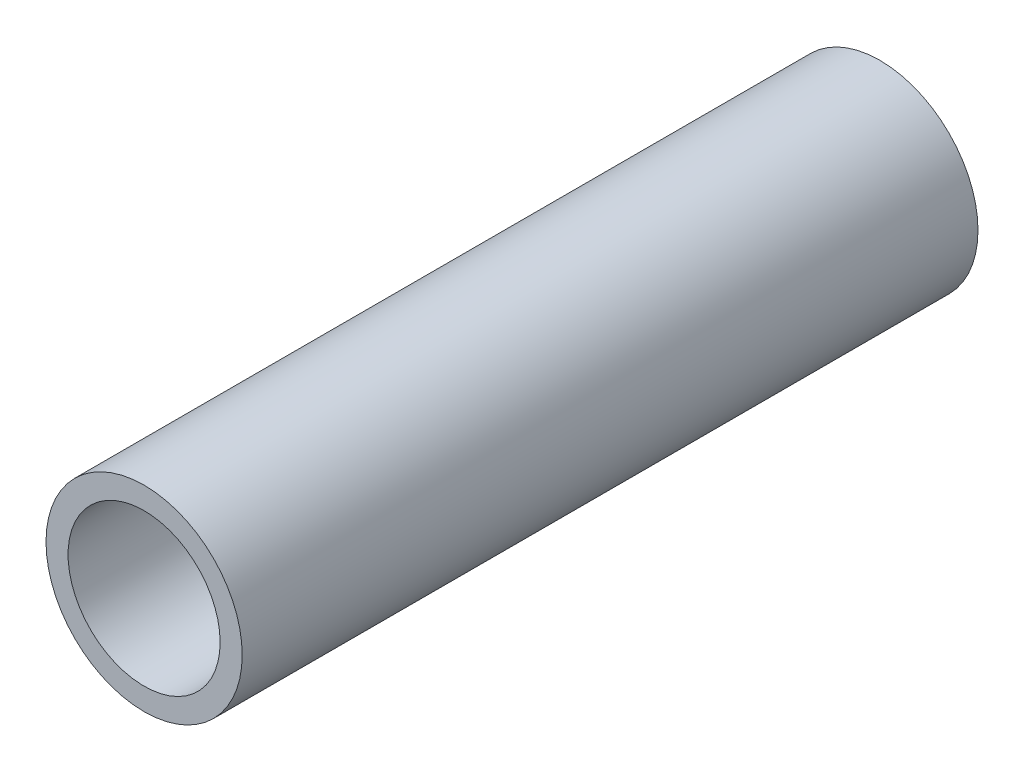
ISO-10303-21;
HEADER;
FILE_DESCRIPTION(('STEP AP214'),'2;1');
FILE_NAME('part.step','',(''),(''),'','','');
FILE_SCHEMA(('AUTOMOTIVE_DESIGN { 1 0 10303 214 1 1 1 1 }'));
ENDSEC;
DATA;
#1=APPLICATION_CONTEXT('core data for automotive mechanical design processes');
#2=APPLICATION_PROTOCOL_DEFINITION('international standard','automotive_design',2000,#1);
#3=PRODUCT_CONTEXT('',#1,'mechanical');
#4=PRODUCT('Part','Part','',(#3));
#5=PRODUCT_RELATED_PRODUCT_CATEGORY('part','',(#4));
#6=PRODUCT_DEFINITION_FORMATION('','',#4);
#7=PRODUCT_DEFINITION_CONTEXT('part definition',#1,'design');
#8=PRODUCT_DEFINITION('design','',#6,#7);
#9=PRODUCT_DEFINITION_SHAPE('','',#8);
#10=(LENGTH_UNIT() NAMED_UNIT(*) SI_UNIT(.MILLI.,.METRE.));
#11=(NAMED_UNIT(*) PLANE_ANGLE_UNIT() SI_UNIT($,.RADIAN.));
#12=(NAMED_UNIT(*) SI_UNIT($,.STERADIAN.) SOLID_ANGLE_UNIT());
#13=UNCERTAINTY_MEASURE_WITH_UNIT(LENGTH_MEASURE(1.E-05),#10,'distance_accuracy_value','');
#14=(GEOMETRIC_REPRESENTATION_CONTEXT(3) GLOBAL_UNCERTAINTY_ASSIGNED_CONTEXT((#13)) GLOBAL_UNIT_ASSIGNED_CONTEXT((#10,
#11,#12)) REPRESENTATION_CONTEXT('',''));
#15=CARTESIAN_POINT('',(0.,0.,0.));
#16=DIRECTION('',(0.,0.,1.));
#17=DIRECTION('',(1.,0.,0.));
#18=AXIS2_PLACEMENT_3D('',#15,#16,#17);
#19=CARTESIAN_POINT('',(0.,0.,7.5));
#20=DIRECTION('',(0.,0.,1.));
#21=DIRECTION('',(1.,0.,0.));
#22=AXIS2_PLACEMENT_3D('',#19,#20,#21);
#23=PLANE('',#22);
#24=CARTESIAN_POINT('',(0.,0.,7.5));
#25=DIRECTION('',(0.,0.,1.));
#26=DIRECTION('',(1.,0.,0.));
#27=AXIS2_PLACEMENT_3D('',#24,#25,#26);
#28=CIRCLE('',#27,1.);
#29=CARTESIAN_POINT('',(1.,0.,7.5));
#30=VERTEX_POINT('',#29);
#31=EDGE_CURVE('E10',#30,#30,#28,.T.);
#32=ORIENTED_EDGE('',*,*,#31,.T.);
#33=EDGE_LOOP('',(#32));
#34=FACE_BOUND('',#33,.T.);
#35=CARTESIAN_POINT('',(0.,0.,7.5));
#36=DIRECTION('',(0.,0.,1.));
#37=DIRECTION('',(1.,0.,0.));
#38=AXIS2_PLACEMENT_3D('',#35,#36,#37);
#39=CIRCLE('',#38,0.775);
#40=CARTESIAN_POINT('',(0.775,0.,7.5));
#41=VERTEX_POINT('',#40);
#42=EDGE_CURVE('E46',#41,#41,#39,.T.);
#43=ORIENTED_EDGE('',*,*,#42,.F.);
#44=EDGE_LOOP('',(#43));
#45=FACE_BOUND('',#44,.T.);
#46=ADVANCED_FACE('F35',(#34,#45),#23,.T.);
#47=CARTESIAN_POINT('',(0.,0.,0.));
#48=DIRECTION('',(0.,0.,1.));
#49=DIRECTION('',(1.,0.,0.));
#50=AXIS2_PLACEMENT_3D('',#47,#48,#49);
#51=PLANE('',#50);
#52=CARTESIAN_POINT('',(0.,0.,0.));
#53=DIRECTION('',(0.,0.,1.));
#54=DIRECTION('',(1.,0.,0.));
#55=AXIS2_PLACEMENT_3D('',#52,#53,#54);
#56=CIRCLE('',#55,1.);
#57=CARTESIAN_POINT('',(1.,0.,0.));
#58=VERTEX_POINT('',#57);
#59=EDGE_CURVE('E39',#58,#58,#56,.T.);
#60=ORIENTED_EDGE('',*,*,#59,.F.);
#61=EDGE_LOOP('',(#60));
#62=FACE_BOUND('',#61,.T.);
#63=CARTESIAN_POINT('',(0.,0.,0.));
#64=DIRECTION('',(0.,0.,1.));
#65=DIRECTION('',(1.,0.,0.));
#66=AXIS2_PLACEMENT_3D('',#63,#64,#65);
#67=CIRCLE('',#66,0.775);
#68=CARTESIAN_POINT('',(0.775,0.,0.));
#69=VERTEX_POINT('',#68);
#70=EDGE_CURVE('E48',#69,#69,#67,.T.);
#71=ORIENTED_EDGE('',*,*,#70,.T.);
#72=EDGE_LOOP('',(#71));
#73=FACE_BOUND('',#72,.T.);
#74=ADVANCED_FACE('F58',(#62,#73),#51,.F.);
#75=CARTESIAN_POINT('',(0.,0.,7.5));
#76=DIRECTION('',(0.,0.,-1.));
#77=DIRECTION('',(-1.,0.,0.));
#78=AXIS2_PLACEMENT_3D('',#75,#76,#77);
#79=CYLINDRICAL_SURFACE('',#78,1.);
#80=ORIENTED_EDGE('',*,*,#31,.F.);
#81=EDGE_LOOP('',(#80));
#82=FACE_BOUND('',#81,.T.);
#83=ORIENTED_EDGE('',*,*,#59,.T.);
#84=EDGE_LOOP('',(#83));
#85=FACE_BOUND('',#84,.T.);
#86=ADVANCED_FACE('F37',(#82,#85),#79,.T.);
#87=CARTESIAN_POINT('',(0.,0.,7.5));
#88=DIRECTION('',(0.,0.,-1.));
#89=DIRECTION('',(-1.,0.,0.));
#90=AXIS2_PLACEMENT_3D('',#87,#88,#89);
#91=CYLINDRICAL_SURFACE('',#90,0.775);
#92=ORIENTED_EDGE('',*,*,#42,.T.);
#93=EDGE_LOOP('',(#92));
#94=FACE_BOUND('',#93,.T.);
#95=ORIENTED_EDGE('',*,*,#70,.F.);
#96=EDGE_LOOP('',(#95));
#97=FACE_BOUND('',#96,.T.);
#98=ADVANCED_FACE('F54',(#94,#97),#91,.F.);
#99=CLOSED_SHELL('',(#46,#74,#86,#98));
#100=MANIFOLD_SOLID_BREP('B2',#99);
#101=ADVANCED_BREP_SHAPE_REPRESENTATION('',(#18,#100),#14);
#102=SHAPE_DEFINITION_REPRESENTATION(#9,#101);
ENDSEC;
END-ISO-10303-21;
